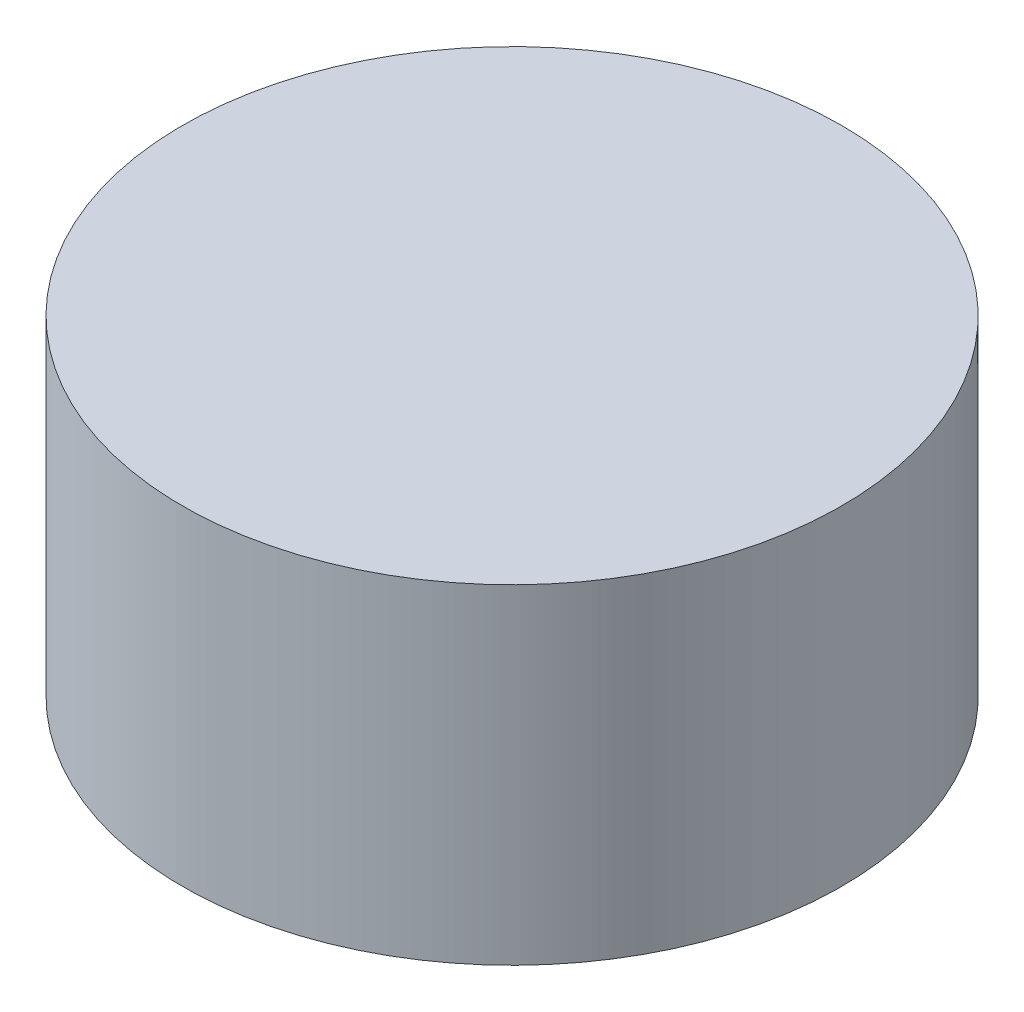
ISO-10303-21;
HEADER;
FILE_DESCRIPTION(('STEP AP214'),'2;1');
FILE_NAME('part.step','',(''),(''),'','','');
FILE_SCHEMA(('AUTOMOTIVE_DESIGN { 1 0 10303 214 1 1 1 1 }'));
ENDSEC;
DATA;
#1=APPLICATION_CONTEXT('core data for automotive mechanical design processes');
#2=APPLICATION_PROTOCOL_DEFINITION('international standard','automotive_design',2000,#1);
#3=PRODUCT_CONTEXT('',#1,'mechanical');
#4=PRODUCT('Part','Part','',(#3));
#5=PRODUCT_RELATED_PRODUCT_CATEGORY('part','',(#4));
#6=PRODUCT_DEFINITION_FORMATION('','',#4);
#7=PRODUCT_DEFINITION_CONTEXT('part definition',#1,'design');
#8=PRODUCT_DEFINITION('design','',#6,#7);
#9=PRODUCT_DEFINITION_SHAPE('','',#8);
#10=(LENGTH_UNIT() NAMED_UNIT(*) SI_UNIT(.MILLI.,.METRE.));
#11=(NAMED_UNIT(*) PLANE_ANGLE_UNIT() SI_UNIT($,.RADIAN.));
#12=(NAMED_UNIT(*) SI_UNIT($,.STERADIAN.) SOLID_ANGLE_UNIT());
#13=UNCERTAINTY_MEASURE_WITH_UNIT(LENGTH_MEASURE(1.E-05),#10,'distance_accuracy_value','');
#14=(GEOMETRIC_REPRESENTATION_CONTEXT(3) GLOBAL_UNCERTAINTY_ASSIGNED_CONTEXT((#13)) GLOBAL_UNIT_ASSIGNED_CONTEXT((#10,
#11,#12)) REPRESENTATION_CONTEXT('',''));
#15=CARTESIAN_POINT('',(0.,0.,0.));
#16=DIRECTION('',(0.,0.,1.));
#17=DIRECTION('',(1.,0.,0.));
#18=AXIS2_PLACEMENT_3D('',#15,#16,#17);
#19=CARTESIAN_POINT('',(0.,-20.0774874371859,0.));
#20=DIRECTION('',(0.,-1.,0.));
#21=DIRECTION('',(0.,0.,-1.));
#22=AXIS2_PLACEMENT_3D('',#19,#20,#21);
#23=CYLINDRICAL_SURFACE('',#22,15.);
#24=CARTESIAN_POINT('',(0.,-4.,0.));
#25=DIRECTION('',(0.,-1.,0.));
#26=DIRECTION('',(0.,0.,-1.));
#27=AXIS2_PLACEMENT_3D('',#24,#25,#26);
#28=CIRCLE('',#27,15.);
#29=CARTESIAN_POINT('',(0.,-4.,-15.));
#30=VERTEX_POINT('',#29);
#31=EDGE_CURVE('E10',#30,#30,#28,.T.);
#32=ORIENTED_EDGE('',*,*,#31,.F.);
#33=EDGE_LOOP('',(#32));
#34=FACE_BOUND('',#33,.T.);
#35=CARTESIAN_POINT('',(0.,11.,0.));
#36=DIRECTION('',(0.,-1.,0.));
#37=DIRECTION('',(0.,0.,-1.));
#38=AXIS2_PLACEMENT_3D('',#35,#36,#37);
#39=CIRCLE('',#38,15.);
#40=CARTESIAN_POINT('',(0.,11.,-15.));
#41=VERTEX_POINT('',#40);
#42=EDGE_CURVE('E356',#41,#41,#39,.T.);
#43=ORIENTED_EDGE('',*,*,#42,.T.);
#44=EDGE_LOOP('',(#43));
#45=FACE_BOUND('',#44,.T.);
#46=ADVANCED_FACE('F346',(#34,#45),#23,.T.);
#47=CARTESIAN_POINT('',(-6.92820323027551,-4.,0.));
#48=DIRECTION('',(0.,1.,0.));
#49=DIRECTION('',(0.,0.,1.));
#50=AXIS2_PLACEMENT_3D('',#47,#48,#49);
#51=PLANE('',#50);
#52=CARTESIAN_POINT('',(0.,-4.,0.));
#53=DIRECTION('',(0.,-1.,0.));
#54=DIRECTION('',(0.,0.,-1.));
#55=AXIS2_PLACEMENT_3D('',#52,#53,#54);
#56=CIRCLE('',#55,6.92820323027551);
#57=CARTESIAN_POINT('',(0.,-4.,-6.92820323027551));
#58=VERTEX_POINT('',#57);
#59=EDGE_CURVE('E352',#58,#58,#56,.T.);
#60=ORIENTED_EDGE('',*,*,#59,.F.);
#61=EDGE_LOOP('',(#60));
#62=FACE_BOUND('',#61,.T.);
#63=ORIENTED_EDGE('',*,*,#31,.T.);
#64=EDGE_LOOP('',(#63));
#65=FACE_BOUND('',#64,.T.);
#66=ADVANCED_FACE('F372',(#62,#65),#51,.F.);
#67=CARTESIAN_POINT('',(0.,0.,0.));
#68=DIRECTION('',(0.,-1.,0.));
#69=DIRECTION('',(-1.,0.,0.));
#70=AXIS2_PLACEMENT_3D('',#67,#68,#69);
#71=SPHERICAL_SURFACE('',#70,8.);
#72=ORIENTED_EDGE('',*,*,#59,.T.);
#73=EDGE_LOOP('',(#72));
#74=FACE_BOUND('',#73,.T.);
#75=ADVANCED_FACE('F366',(#74),#71,.F.);
#76=CARTESIAN_POINT('',(0.,11.,0.));
#77=DIRECTION('',(0.,-1.,0.));
#78=DIRECTION('',(0.,0.,-1.));
#79=AXIS2_PLACEMENT_3D('',#76,#77,#78);
#80=PLANE('',#79);
#81=ORIENTED_EDGE('',*,*,#42,.F.);
#82=EDGE_LOOP('',(#81));
#83=FACE_BOUND('',#82,.T.);
#84=ADVANCED_FACE('F364',(#83),#80,.F.);
#85=CLOSED_SHELL('',(#46,#66,#75,#84));
#86=MANIFOLD_SOLID_BREP('B2',#85);
#87=ADVANCED_BREP_SHAPE_REPRESENTATION('',(#18,#86),#14);
#88=SHAPE_DEFINITION_REPRESENTATION(#9,#87);
ENDSEC;
END-ISO-10303-21;
